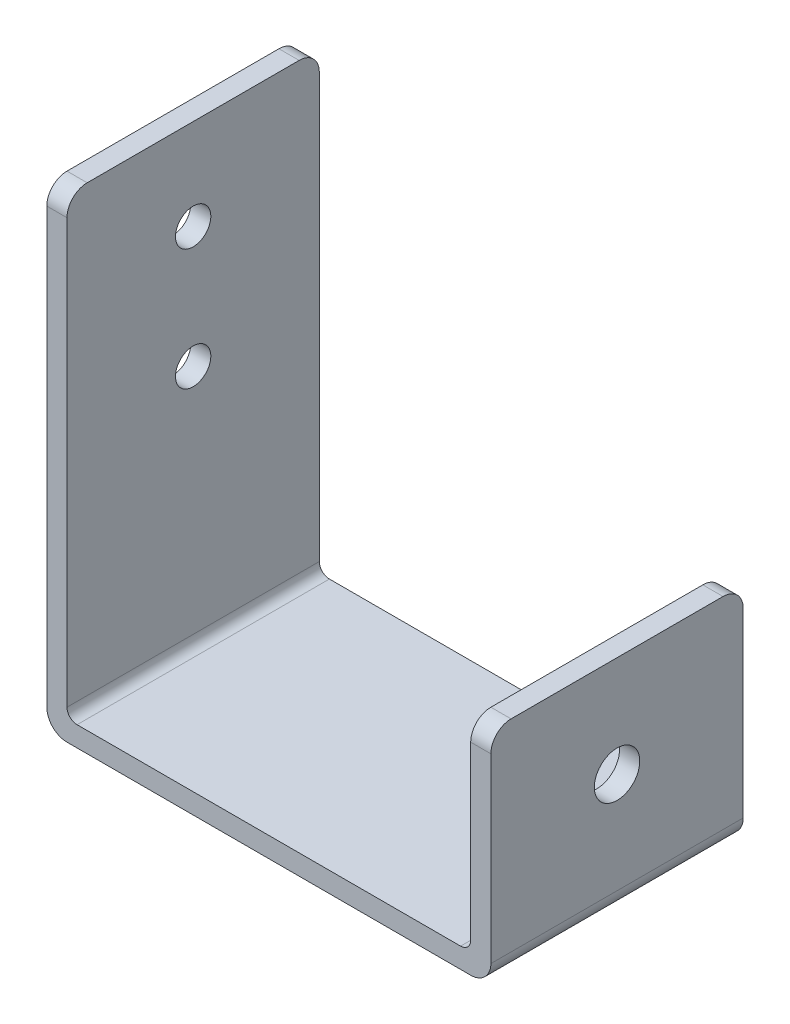
ISO-10303-21;
HEADER;
FILE_DESCRIPTION(('STEP AP214'),'2;1');
FILE_NAME('part.step','',(''),(''),'','','');
FILE_SCHEMA(('AUTOMOTIVE_DESIGN { 1 0 10303 214 1 1 1 1 }'));
ENDSEC;
DATA;
#1=APPLICATION_CONTEXT('core data for automotive mechanical design processes');
#2=APPLICATION_PROTOCOL_DEFINITION('international standard','automotive_design',2000,#1);
#3=PRODUCT_CONTEXT('',#1,'mechanical');
#4=PRODUCT('Part','Part','',(#3));
#5=PRODUCT_RELATED_PRODUCT_CATEGORY('part','',(#4));
#6=PRODUCT_DEFINITION_FORMATION('','',#4);
#7=PRODUCT_DEFINITION_CONTEXT('part definition',#1,'design');
#8=PRODUCT_DEFINITION('design','',#6,#7);
#9=PRODUCT_DEFINITION_SHAPE('','',#8);
#10=(LENGTH_UNIT() NAMED_UNIT(*) SI_UNIT(.MILLI.,.METRE.));
#11=(NAMED_UNIT(*) PLANE_ANGLE_UNIT() SI_UNIT($,.RADIAN.));
#12=(NAMED_UNIT(*) SI_UNIT($,.STERADIAN.) SOLID_ANGLE_UNIT());
#13=UNCERTAINTY_MEASURE_WITH_UNIT(LENGTH_MEASURE(1.E-05),#10,'distance_accuracy_value','');
#14=(GEOMETRIC_REPRESENTATION_CONTEXT(3) GLOBAL_UNCERTAINTY_ASSIGNED_CONTEXT((#13)) GLOBAL_UNIT_ASSIGNED_CONTEXT((#10,
#11,#12)) REPRESENTATION_CONTEXT('',''));
#15=CARTESIAN_POINT('',(0.,0.,0.));
#16=DIRECTION('',(0.,0.,1.));
#17=DIRECTION('',(1.,0.,0.));
#18=AXIS2_PLACEMENT_3D('',#15,#16,#17);
#19=CARTESIAN_POINT('',(42.,0.,25.));
#20=DIRECTION('',(-1.,0.,0.));
#21=DIRECTION('',(0.,0.,1.));
#22=AXIS2_PLACEMENT_3D('',#19,#20,#21);
#23=PLANE('',#22);
#24=CARTESIAN_POINT('',(42.,10.,12.5));
#25=DIRECTION('',(1.,0.,0.));
#26=DIRECTION('',(0.,0.,-1.));
#27=AXIS2_PLACEMENT_3D('',#24,#25,#26);
#28=CIRCLE('',#27,2.25);
#29=CARTESIAN_POINT('',(42.,10.,10.25));
#30=VERTEX_POINT('',#29);
#31=EDGE_CURVE('E291',#30,#30,#28,.T.);
#32=ORIENTED_EDGE('',*,*,#31,.F.);
#33=EDGE_LOOP('',(#32));
#34=FACE_BOUND('',#33,.T.);
#35=DIRECTION('',(0.,0.,-1.));
#36=VECTOR('',#35,1.);
#37=CARTESIAN_POINT('',(42.,20.,25.));
#38=LINE('',#37,#36);
#39=CARTESIAN_POINT('',(42.,20.,23.));
#40=VERTEX_POINT('',#39);
#41=CARTESIAN_POINT('',(42.,20.,2.));
#42=VERTEX_POINT('',#41);
#43=EDGE_CURVE('E172',#40,#42,#38,.T.);
#44=ORIENTED_EDGE('',*,*,#43,.F.);
#45=CARTESIAN_POINT('',(42.,18.,23.));
#46=DIRECTION('',(-1.,0.,0.));
#47=DIRECTION('',(0.,0.,1.));
#48=AXIS2_PLACEMENT_3D('',#45,#46,#47);
#49=CIRCLE('',#48,2.);
#50=CARTESIAN_POINT('',(42.,18.,25.));
#51=VERTEX_POINT('',#50);
#52=EDGE_CURVE('E225',#40,#51,#49,.F.);
#53=ORIENTED_EDGE('',*,*,#52,.T.);
#54=DIRECTION('',(0.,1.,0.));
#55=VECTOR('',#54,1.);
#56=CARTESIAN_POINT('',(42.,0.,25.));
#57=LINE('',#56,#55);
#58=CARTESIAN_POINT('',(42.,0.,25.));
#59=VERTEX_POINT('',#58);
#60=EDGE_CURVE('E257',#59,#51,#57,.T.);
#61=ORIENTED_EDGE('',*,*,#60,.F.);
#62=DIRECTION('',(0.,0.,-1.));
#63=VECTOR('',#62,1.);
#64=CARTESIAN_POINT('',(42.,0.,25.));
#65=LINE('',#64,#63);
#66=CARTESIAN_POINT('',(42.,0.,0.));
#67=VERTEX_POINT('',#66);
#68=EDGE_CURVE('E189',#59,#67,#65,.T.);
#69=ORIENTED_EDGE('',*,*,#68,.T.);
#70=DIRECTION('',(0.,1.,0.));
#71=VECTOR('',#70,1.);
#72=CARTESIAN_POINT('',(42.,0.,0.));
#73=LINE('',#72,#71);
#74=CARTESIAN_POINT('',(42.,18.,0.));
#75=VERTEX_POINT('',#74);
#76=EDGE_CURVE('E263',#67,#75,#73,.T.);
#77=ORIENTED_EDGE('',*,*,#76,.T.);
#78=CARTESIAN_POINT('',(42.,18.,2.));
#79=DIRECTION('',(-1.,0.,0.));
#80=DIRECTION('',(0.,0.,1.));
#81=AXIS2_PLACEMENT_3D('',#78,#79,#80);
#82=CIRCLE('',#81,2.);
#83=EDGE_CURVE('E214',#75,#42,#82,.F.);
#84=ORIENTED_EDGE('',*,*,#83,.T.);
#85=EDGE_LOOP('',(#44,#53,#61,#69,#77,#84));
#86=FACE_BOUND('',#85,.T.);
#87=ADVANCED_FACE('F35',(#34,#86),#23,.F.);
#88=CARTESIAN_POINT('',(40.,20.,25.));
#89=DIRECTION('',(0.,1.,0.));
#90=DIRECTION('',(0.,0.,1.));
#91=AXIS2_PLACEMENT_3D('',#88,#89,#90);
#92=PLANE('',#91);
#93=DIRECTION('',(0.,0.,-1.));
#94=VECTOR('',#93,1.);
#95=CARTESIAN_POINT('',(40.,20.,25.));
#96=LINE('',#95,#94);
#97=CARTESIAN_POINT('',(40.,20.,23.));
#98=VERTEX_POINT('',#97);
#99=CARTESIAN_POINT('',(40.,20.,2.));
#100=VERTEX_POINT('',#99);
#101=EDGE_CURVE('E175',#98,#100,#96,.T.);
#102=ORIENTED_EDGE('',*,*,#101,.F.);
#103=DIRECTION('',(1.,0.,0.));
#104=VECTOR('',#103,1.);
#105=CARTESIAN_POINT('',(42.,20.,23.));
#106=LINE('',#105,#104);
#107=EDGE_CURVE('E222',#98,#40,#106,.T.);
#108=ORIENTED_EDGE('',*,*,#107,.T.);
#109=ORIENTED_EDGE('',*,*,#43,.T.);
#110=DIRECTION('',(1.,0.,0.));
#111=VECTOR('',#110,1.);
#112=CARTESIAN_POINT('',(40.,20.,2.));
#113=LINE('',#112,#111);
#114=EDGE_CURVE('E217',#42,#100,#113,.F.);
#115=ORIENTED_EDGE('',*,*,#114,.T.);
#116=EDGE_LOOP('',(#102,#108,#109,#115));
#117=FACE_BOUND('',#116,.T.);
#118=ADVANCED_FACE('F310',(#117),#92,.T.);
#119=CARTESIAN_POINT('',(40.,0.,25.));
#120=DIRECTION('',(-1.,0.,0.));
#121=DIRECTION('',(0.,0.,1.));
#122=AXIS2_PLACEMENT_3D('',#119,#120,#121);
#123=PLANE('',#122);
#124=CARTESIAN_POINT('',(40.,10.,12.5));
#125=DIRECTION('',(1.,0.,0.));
#126=DIRECTION('',(0.,0.,-1.));
#127=AXIS2_PLACEMENT_3D('',#124,#125,#126);
#128=CIRCLE('',#127,2.25);
#129=CARTESIAN_POINT('',(40.,10.,10.25));
#130=VERTEX_POINT('',#129);
#131=EDGE_CURVE('E288',#130,#130,#128,.T.);
#132=ORIENTED_EDGE('',*,*,#131,.T.);
#133=EDGE_LOOP('',(#132));
#134=FACE_BOUND('',#133,.T.);
#135=DIRECTION('',(0.,1.,0.));
#136=VECTOR('',#135,1.);
#137=CARTESIAN_POINT('',(40.,0.,25.));
#138=LINE('',#137,#136);
#139=CARTESIAN_POINT('',(40.,1.,25.));
#140=VERTEX_POINT('',#139);
#141=CARTESIAN_POINT('',(40.,18.,25.));
#142=VERTEX_POINT('',#141);
#143=EDGE_CURVE('E274',#140,#142,#138,.T.);
#144=ORIENTED_EDGE('',*,*,#143,.T.);
#145=CARTESIAN_POINT('',(40.,18.,23.));
#146=DIRECTION('',(-1.,0.,0.));
#147=DIRECTION('',(0.,0.,1.));
#148=AXIS2_PLACEMENT_3D('',#145,#146,#147);
#149=CIRCLE('',#148,2.);
#150=EDGE_CURVE('E229',#142,#98,#149,.T.);
#151=ORIENTED_EDGE('',*,*,#150,.T.);
#152=ORIENTED_EDGE('',*,*,#101,.T.);
#153=CARTESIAN_POINT('',(40.,18.,2.));
#154=DIRECTION('',(-1.,0.,0.));
#155=DIRECTION('',(0.,0.,1.));
#156=AXIS2_PLACEMENT_3D('',#153,#154,#155);
#157=CIRCLE('',#156,2.);
#158=CARTESIAN_POINT('',(40.,18.,0.));
#159=VERTEX_POINT('',#158);
#160=EDGE_CURVE('E220',#100,#159,#157,.T.);
#161=ORIENTED_EDGE('',*,*,#160,.T.);
#162=DIRECTION('',(0.,1.,0.));
#163=VECTOR('',#162,1.);
#164=CARTESIAN_POINT('',(40.,0.,0.));
#165=LINE('',#164,#163);
#166=CARTESIAN_POINT('',(40.,1.,0.));
#167=VERTEX_POINT('',#166);
#168=EDGE_CURVE('E260',#167,#159,#165,.T.);
#169=ORIENTED_EDGE('',*,*,#168,.F.);
#170=DIRECTION('',(0.,0.,-1.));
#171=VECTOR('',#170,1.);
#172=CARTESIAN_POINT('',(40.,1.,25.));
#173=LINE('',#172,#171);
#174=EDGE_CURVE('E183',#167,#140,#173,.F.);
#175=ORIENTED_EDGE('',*,*,#174,.T.);
#176=EDGE_LOOP('',(#144,#151,#152,#161,#169,#175));
#177=FACE_BOUND('',#176,.T.);
#178=ADVANCED_FACE('F297',(#134,#177),#123,.T.);
#179=CARTESIAN_POINT('',(0.,0.,25.));
#180=DIRECTION('',(0.,1.,0.));
#181=DIRECTION('',(0.,0.,1.));
#182=AXIS2_PLACEMENT_3D('',#179,#180,#181);
#183=PLANE('',#182);
#184=DIRECTION('',(1.,0.,0.));
#185=VECTOR('',#184,1.);
#186=CARTESIAN_POINT('',(0.,0.,25.));
#187=LINE('',#186,#185);
#188=CARTESIAN_POINT('',(1.,0.,25.));
#189=VERTEX_POINT('',#188);
#190=CARTESIAN_POINT('',(39.,0.,25.));
#191=VERTEX_POINT('',#190);
#192=EDGE_CURVE('E271',#189,#191,#187,.T.);
#193=ORIENTED_EDGE('',*,*,#192,.T.);
#194=DIRECTION('',(0.,0.,-1.));
#195=VECTOR('',#194,1.);
#196=CARTESIAN_POINT('',(39.,0.,0.));
#197=LINE('',#196,#195);
#198=CARTESIAN_POINT('',(39.,0.,0.));
#199=VERTEX_POINT('',#198);
#200=EDGE_CURVE('E180',#191,#199,#197,.T.);
#201=ORIENTED_EDGE('',*,*,#200,.T.);
#202=DIRECTION('',(1.,0.,0.));
#203=VECTOR('',#202,1.);
#204=CARTESIAN_POINT('',(0.,0.,0.));
#205=LINE('',#204,#203);
#206=CARTESIAN_POINT('',(1.,0.,0.));
#207=VERTEX_POINT('',#206);
#208=EDGE_CURVE('E158',#207,#199,#205,.T.);
#209=ORIENTED_EDGE('',*,*,#208,.F.);
#210=DIRECTION('',(0.,0.,-1.));
#211=VECTOR('',#210,1.);
#212=CARTESIAN_POINT('',(1.,0.,25.));
#213=LINE('',#212,#211);
#214=EDGE_CURVE('E166',#207,#189,#213,.F.);
#215=ORIENTED_EDGE('',*,*,#214,.T.);
#216=EDGE_LOOP('',(#193,#201,#209,#215));
#217=FACE_BOUND('',#216,.T.);
#218=ADVANCED_FACE('F333',(#217),#183,.T.);
#219=CARTESIAN_POINT('',(0.,0.,25.));
#220=DIRECTION('',(1.,0.,0.));
#221=DIRECTION('',(0.,0.,-1.));
#222=AXIS2_PLACEMENT_3D('',#219,#220,#221);
#223=PLANE('',#222);
#224=CARTESIAN_POINT('',(0.,24.,12.5));
#225=DIRECTION('',(-1.,0.,0.));
#226=DIRECTION('',(0.,0.,1.));
#227=AXIS2_PLACEMENT_3D('',#224,#225,#226);
#228=CIRCLE('',#227,1.75);
#229=CARTESIAN_POINT('',(0.,24.,14.25));
#230=VERTEX_POINT('',#229);
#231=EDGE_CURVE('E282',#230,#230,#228,.T.);
#232=ORIENTED_EDGE('',*,*,#231,.T.);
#233=EDGE_LOOP('',(#232));
#234=FACE_BOUND('',#233,.T.);
#235=CARTESIAN_POINT('',(0.,36.,12.5));
#236=DIRECTION('',(-1.,0.,0.));
#237=DIRECTION('',(0.,0.,1.));
#238=AXIS2_PLACEMENT_3D('',#235,#236,#237);
#239=CIRCLE('',#238,1.75);
#240=CARTESIAN_POINT('',(0.,36.,14.25));
#241=VERTEX_POINT('',#240);
#242=EDGE_CURVE('E266',#241,#241,#239,.T.);
#243=ORIENTED_EDGE('',*,*,#242,.T.);
#244=EDGE_LOOP('',(#243));
#245=FACE_BOUND('',#244,.T.);
#246=DIRECTION('',(0.,0.,-1.));
#247=VECTOR('',#246,1.);
#248=CARTESIAN_POINT('',(0.,45.,25.));
#249=LINE('',#248,#247);
#250=CARTESIAN_POINT('',(0.,45.,23.));
#251=VERTEX_POINT('',#250);
#252=CARTESIAN_POINT('',(0.,45.,2.));
#253=VERTEX_POINT('',#252);
#254=EDGE_CURVE('E246',#251,#253,#249,.T.);
#255=ORIENTED_EDGE('',*,*,#254,.F.);
#256=CARTESIAN_POINT('',(0.,43.,23.));
#257=DIRECTION('',(1.,0.,0.));
#258=DIRECTION('',(0.,0.,-1.));
#259=AXIS2_PLACEMENT_3D('',#256,#257,#258);
#260=CIRCLE('',#259,2.);
#261=CARTESIAN_POINT('',(0.,43.,25.));
#262=VERTEX_POINT('',#261);
#263=EDGE_CURVE('E57',#251,#262,#260,.T.);
#264=ORIENTED_EDGE('',*,*,#263,.T.);
#265=DIRECTION('',(0.,-1.,0.));
#266=VECTOR('',#265,1.);
#267=CARTESIAN_POINT('',(0.,0.,25.));
#268=LINE('',#267,#266);
#269=CARTESIAN_POINT('',(0.,1.,25.));
#270=VERTEX_POINT('',#269);
#271=EDGE_CURVE('E170',#262,#270,#268,.T.);
#272=ORIENTED_EDGE('',*,*,#271,.T.);
#273=DIRECTION('',(0.,0.,-1.));
#274=VECTOR('',#273,1.);
#275=CARTESIAN_POINT('',(0.,1.,0.));
#276=LINE('',#275,#274);
#277=CARTESIAN_POINT('',(0.,1.,0.));
#278=VERTEX_POINT('',#277);
#279=EDGE_CURVE('E165',#270,#278,#276,.T.);
#280=ORIENTED_EDGE('',*,*,#279,.T.);
#281=DIRECTION('',(0.,-1.,0.));
#282=VECTOR('',#281,1.);
#283=CARTESIAN_POINT('',(0.,0.,0.));
#284=LINE('',#283,#282);
#285=CARTESIAN_POINT('',(0.,43.,0.));
#286=VERTEX_POINT('',#285);
#287=EDGE_CURVE('E146',#286,#278,#284,.T.);
#288=ORIENTED_EDGE('',*,*,#287,.F.);
#289=CARTESIAN_POINT('',(0.,43.,2.));
#290=DIRECTION('',(1.,0.,0.));
#291=DIRECTION('',(0.,0.,-1.));
#292=AXIS2_PLACEMENT_3D('',#289,#290,#291);
#293=CIRCLE('',#292,2.);
#294=EDGE_CURVE('E232',#286,#253,#293,.T.);
#295=ORIENTED_EDGE('',*,*,#294,.T.);
#296=EDGE_LOOP('',(#255,#264,#272,#280,#288,#295));
#297=FACE_BOUND('',#296,.T.);
#298=ADVANCED_FACE('F169',(#234,#245,#297),#223,.T.);
#299=CARTESIAN_POINT('',(-2.,45.,25.));
#300=DIRECTION('',(0.,1.,0.));
#301=DIRECTION('',(0.,0.,1.));
#302=AXIS2_PLACEMENT_3D('',#299,#300,#301);
#303=PLANE('',#302);
#304=DIRECTION('',(0.,0.,-1.));
#305=VECTOR('',#304,1.);
#306=CARTESIAN_POINT('',(-2.,45.,25.));
#307=LINE('',#306,#305);
#308=CARTESIAN_POINT('',(-2.,45.,23.));
#309=VERTEX_POINT('',#308);
#310=CARTESIAN_POINT('',(-2.,45.,2.));
#311=VERTEX_POINT('',#310);
#312=EDGE_CURVE('E247',#309,#311,#307,.T.);
#313=ORIENTED_EDGE('',*,*,#312,.F.);
#314=DIRECTION('',(1.,0.,0.));
#315=VECTOR('',#314,1.);
#316=CARTESIAN_POINT('',(0.,45.,23.));
#317=LINE('',#316,#315);
#318=EDGE_CURVE('E239',#309,#251,#317,.T.);
#319=ORIENTED_EDGE('',*,*,#318,.T.);
#320=ORIENTED_EDGE('',*,*,#254,.T.);
#321=DIRECTION('',(1.,0.,0.));
#322=VECTOR('',#321,1.);
#323=CARTESIAN_POINT('',(-2.,45.,2.));
#324=LINE('',#323,#322);
#325=EDGE_CURVE('E234',#253,#311,#324,.F.);
#326=ORIENTED_EDGE('',*,*,#325,.T.);
#327=EDGE_LOOP('',(#313,#319,#320,#326));
#328=FACE_BOUND('',#327,.T.);
#329=ADVANCED_FACE('F245',(#328),#303,.T.);
#330=CARTESIAN_POINT('',(-2.,0.,25.));
#331=DIRECTION('',(1.,0.,0.));
#332=DIRECTION('',(0.,0.,-1.));
#333=AXIS2_PLACEMENT_3D('',#330,#331,#332);
#334=PLANE('',#333);
#335=CARTESIAN_POINT('',(-2.,24.,12.5));
#336=DIRECTION('',(-1.,0.,0.));
#337=DIRECTION('',(0.,0.,1.));
#338=AXIS2_PLACEMENT_3D('',#335,#336,#337);
#339=CIRCLE('',#338,1.75);
#340=CARTESIAN_POINT('',(-2.,24.,14.25));
#341=VERTEX_POINT('',#340);
#342=EDGE_CURVE('E285',#341,#341,#339,.T.);
#343=ORIENTED_EDGE('',*,*,#342,.F.);
#344=EDGE_LOOP('',(#343));
#345=FACE_BOUND('',#344,.T.);
#346=CARTESIAN_POINT('',(-2.,36.,12.5));
#347=DIRECTION('',(-1.,0.,0.));
#348=DIRECTION('',(0.,0.,1.));
#349=AXIS2_PLACEMENT_3D('',#346,#347,#348);
#350=CIRCLE('',#349,1.75);
#351=CARTESIAN_POINT('',(-2.,36.,14.25));
#352=VERTEX_POINT('',#351);
#353=EDGE_CURVE('E279',#352,#352,#350,.T.);
#354=ORIENTED_EDGE('',*,*,#353,.F.);
#355=EDGE_LOOP('',(#354));
#356=FACE_BOUND('',#355,.T.);
#357=DIRECTION('',(0.,1.,0.));
#358=VECTOR('',#357,1.);
#359=CARTESIAN_POINT('',(-2.,0.,25.));
#360=LINE('',#359,#358);
#361=CARTESIAN_POINT('',(-2.,43.,25.));
#362=VERTEX_POINT('',#361);
#363=CARTESIAN_POINT('',(-2.,0.,25.));
#364=VERTEX_POINT('',#363);
#365=EDGE_CURVE('E268',#362,#364,#360,.F.);
#366=ORIENTED_EDGE('',*,*,#365,.F.);
#367=CARTESIAN_POINT('',(-2.,43.,23.));
#368=DIRECTION('',(1.,0.,0.));
#369=DIRECTION('',(0.,0.,-1.));
#370=AXIS2_PLACEMENT_3D('',#367,#368,#369);
#371=CIRCLE('',#370,2.);
#372=EDGE_CURVE('E11',#362,#309,#371,.F.);
#373=ORIENTED_EDGE('',*,*,#372,.T.);
#374=ORIENTED_EDGE('',*,*,#312,.T.);
#375=CARTESIAN_POINT('',(-2.,43.,2.));
#376=DIRECTION('',(1.,0.,0.));
#377=DIRECTION('',(0.,0.,-1.));
#378=AXIS2_PLACEMENT_3D('',#375,#376,#377);
#379=CIRCLE('',#378,2.);
#380=CARTESIAN_POINT('',(-2.,43.,0.));
#381=VERTEX_POINT('',#380);
#382=EDGE_CURVE('E237',#311,#381,#379,.F.);
#383=ORIENTED_EDGE('',*,*,#382,.T.);
#384=DIRECTION('',(0.,1.,0.));
#385=VECTOR('',#384,1.);
#386=CARTESIAN_POINT('',(-2.,0.,0.));
#387=LINE('',#386,#385);
#388=CARTESIAN_POINT('',(-2.,0.,0.));
#389=VERTEX_POINT('',#388);
#390=EDGE_CURVE('E157',#381,#389,#387,.F.);
#391=ORIENTED_EDGE('',*,*,#390,.T.);
#392=DIRECTION('',(0.,0.,-1.));
#393=VECTOR('',#392,1.);
#394=CARTESIAN_POINT('',(-2.,0.,25.));
#395=LINE('',#394,#393);
#396=EDGE_CURVE('E206',#389,#364,#395,.F.);
#397=ORIENTED_EDGE('',*,*,#396,.T.);
#398=EDGE_LOOP('',(#366,#373,#374,#383,#391,#397));
#399=FACE_BOUND('',#398,.T.);
#400=ADVANCED_FACE('F354',(#345,#356,#399),#334,.F.);
#401=CARTESIAN_POINT('',(0.,-2.,25.));
#402=DIRECTION('',(0.,1.,0.));
#403=DIRECTION('',(0.,0.,1.));
#404=AXIS2_PLACEMENT_3D('',#401,#402,#403);
#405=PLANE('',#404);
#406=DIRECTION('',(1.,0.,0.));
#407=VECTOR('',#406,1.);
#408=CARTESIAN_POINT('',(0.,-2.,25.));
#409=LINE('',#408,#407);
#410=CARTESIAN_POINT('',(0.,-2.,25.));
#411=VERTEX_POINT('',#410);
#412=CARTESIAN_POINT('',(40.,-2.,25.));
#413=VERTEX_POINT('',#412);
#414=EDGE_CURVE('E252',#411,#413,#409,.T.);
#415=ORIENTED_EDGE('',*,*,#414,.F.);
#416=DIRECTION('',(0.,0.,-1.));
#417=VECTOR('',#416,1.);
#418=CARTESIAN_POINT('',(0.,-2.,25.));
#419=LINE('',#418,#417);
#420=CARTESIAN_POINT('',(0.,-2.,0.));
#421=VERTEX_POINT('',#420);
#422=EDGE_CURVE('E200',#411,#421,#419,.T.);
#423=ORIENTED_EDGE('',*,*,#422,.T.);
#424=DIRECTION('',(1.,0.,0.));
#425=VECTOR('',#424,1.);
#426=CARTESIAN_POINT('',(0.,-2.,0.));
#427=LINE('',#426,#425);
#428=CARTESIAN_POINT('',(40.,-2.,0.));
#429=VERTEX_POINT('',#428);
#430=EDGE_CURVE('E255',#421,#429,#427,.T.);
#431=ORIENTED_EDGE('',*,*,#430,.T.);
#432=DIRECTION('',(0.,0.,-1.));
#433=VECTOR('',#432,1.);
#434=CARTESIAN_POINT('',(40.,-2.,25.));
#435=LINE('',#434,#433);
#436=EDGE_CURVE('E195',#429,#413,#435,.F.);
#437=ORIENTED_EDGE('',*,*,#436,.T.);
#438=EDGE_LOOP('',(#415,#423,#431,#437));
#439=FACE_BOUND('',#438,.T.);
#440=ADVANCED_FACE('F362',(#439),#405,.F.);
#441=CARTESIAN_POINT('',(0.,0.,25.));
#442=DIRECTION('',(0.,0.,-1.));
#443=DIRECTION('',(-1.,0.,0.));
#444=AXIS2_PLACEMENT_3D('',#441,#442,#443);
#445=PLANE('',#444);
#446=ORIENTED_EDGE('',*,*,#271,.F.);
#447=DIRECTION('',(1.,0.,0.));
#448=VECTOR('',#447,1.);
#449=CARTESIAN_POINT('',(-2.,43.,25.));
#450=LINE('',#449,#448);
#451=EDGE_CURVE('E43',#262,#362,#450,.F.);
#452=ORIENTED_EDGE('',*,*,#451,.T.);
#453=ORIENTED_EDGE('',*,*,#365,.T.);
#454=CARTESIAN_POINT('',(0.,0.,25.));
#455=DIRECTION('',(0.,0.,-1.));
#456=DIRECTION('',(-1.,0.,0.));
#457=AXIS2_PLACEMENT_3D('',#454,#455,#456);
#458=CIRCLE('',#457,2.);
#459=EDGE_CURVE('E209',#364,#411,#458,.F.);
#460=ORIENTED_EDGE('',*,*,#459,.T.);
#461=ORIENTED_EDGE('',*,*,#414,.T.);
#462=CARTESIAN_POINT('',(40.,0.,25.));
#463=DIRECTION('',(0.,0.,-1.));
#464=DIRECTION('',(-1.,0.,0.));
#465=AXIS2_PLACEMENT_3D('',#462,#463,#464);
#466=CIRCLE('',#465,2.);
#467=EDGE_CURVE('E198',#413,#59,#466,.F.);
#468=ORIENTED_EDGE('',*,*,#467,.T.);
#469=ORIENTED_EDGE('',*,*,#60,.T.);
#470=DIRECTION('',(1.,0.,0.));
#471=VECTOR('',#470,1.);
#472=CARTESIAN_POINT('',(40.,18.,25.));
#473=LINE('',#472,#471);
#474=EDGE_CURVE('E227',#51,#142,#473,.F.);
#475=ORIENTED_EDGE('',*,*,#474,.T.);
#476=ORIENTED_EDGE('',*,*,#143,.F.);
#477=CARTESIAN_POINT('',(39.,1.,25.));
#478=DIRECTION('',(0.,0.,-1.));
#479=DIRECTION('',(-1.,0.,0.));
#480=AXIS2_PLACEMENT_3D('',#477,#478,#479);
#481=CIRCLE('',#480,1.);
#482=EDGE_CURVE('E187',#140,#191,#481,.T.);
#483=ORIENTED_EDGE('',*,*,#482,.T.);
#484=ORIENTED_EDGE('',*,*,#192,.F.);
#485=CARTESIAN_POINT('',(1.,1.,25.));
#486=DIRECTION('',(0.,0.,-1.));
#487=DIRECTION('',(-1.,0.,0.));
#488=AXIS2_PLACEMENT_3D('',#485,#486,#487);
#489=CIRCLE('',#488,1.);
#490=EDGE_CURVE('E167',#189,#270,#489,.T.);
#491=ORIENTED_EDGE('',*,*,#490,.T.);
#492=EDGE_LOOP('',(#446,#452,#453,#460,#461,#468,#469,#475,#476,#483,#484,#491));
#493=FACE_BOUND('',#492,.T.);
#494=ADVANCED_FACE('F324',(#493),#445,.F.);
#495=CARTESIAN_POINT('',(0.,0.,0.));
#496=DIRECTION('',(0.,0.,-1.));
#497=DIRECTION('',(-1.,0.,0.));
#498=AXIS2_PLACEMENT_3D('',#495,#496,#497);
#499=PLANE('',#498);
#500=ORIENTED_EDGE('',*,*,#390,.F.);
#501=DIRECTION('',(1.,0.,0.));
#502=VECTOR('',#501,1.);
#503=CARTESIAN_POINT('',(0.,43.,0.));
#504=LINE('',#503,#502);
#505=EDGE_CURVE('E154',#381,#286,#504,.T.);
#506=ORIENTED_EDGE('',*,*,#505,.T.);
#507=ORIENTED_EDGE('',*,*,#287,.T.);
#508=CARTESIAN_POINT('',(1.,1.,0.));
#509=DIRECTION('',(0.,0.,-1.));
#510=DIRECTION('',(-1.,0.,0.));
#511=AXIS2_PLACEMENT_3D('',#508,#509,#510);
#512=CIRCLE('',#511,1.);
#513=EDGE_CURVE('E151',#278,#207,#512,.F.);
#514=ORIENTED_EDGE('',*,*,#513,.T.);
#515=ORIENTED_EDGE('',*,*,#208,.T.);
#516=CARTESIAN_POINT('',(39.,1.,0.));
#517=DIRECTION('',(0.,0.,-1.));
#518=DIRECTION('',(-1.,0.,0.));
#519=AXIS2_PLACEMENT_3D('',#516,#517,#518);
#520=CIRCLE('',#519,1.);
#521=EDGE_CURVE('E185',#199,#167,#520,.F.);
#522=ORIENTED_EDGE('',*,*,#521,.T.);
#523=ORIENTED_EDGE('',*,*,#168,.T.);
#524=DIRECTION('',(1.,0.,0.));
#525=VECTOR('',#524,1.);
#526=CARTESIAN_POINT('',(0.,18.,0.));
#527=LINE('',#526,#525);
#528=EDGE_CURVE('E211',#159,#75,#527,.T.);
#529=ORIENTED_EDGE('',*,*,#528,.T.);
#530=ORIENTED_EDGE('',*,*,#76,.F.);
#531=CARTESIAN_POINT('',(40.,0.,0.));
#532=DIRECTION('',(0.,0.,-1.));
#533=DIRECTION('',(-1.,0.,0.));
#534=AXIS2_PLACEMENT_3D('',#531,#532,#533);
#535=CIRCLE('',#534,2.);
#536=EDGE_CURVE('E192',#67,#429,#535,.T.);
#537=ORIENTED_EDGE('',*,*,#536,.T.);
#538=ORIENTED_EDGE('',*,*,#430,.F.);
#539=CARTESIAN_POINT('',(0.,0.,0.));
#540=DIRECTION('',(0.,0.,-1.));
#541=DIRECTION('',(-1.,0.,0.));
#542=AXIS2_PLACEMENT_3D('',#539,#540,#541);
#543=CIRCLE('',#542,2.);
#544=EDGE_CURVE('E203',#421,#389,#543,.T.);
#545=ORIENTED_EDGE('',*,*,#544,.T.);
#546=EDGE_LOOP('',(#500,#506,#507,#514,#515,#522,#523,#529,#530,#537,#538,#545));
#547=FACE_BOUND('',#546,.T.);
#548=ADVANCED_FACE('F149',(#547),#499,.T.);
#549=CARTESIAN_POINT('',(1.,1.,25.));
#550=DIRECTION('',(0.,0.,1.));
#551=DIRECTION('',(1.,0.,0.));
#552=AXIS2_PLACEMENT_3D('',#549,#550,#551);
#553=CYLINDRICAL_SURFACE('',#552,1.);
#554=ORIENTED_EDGE('',*,*,#490,.F.);
#555=ORIENTED_EDGE('',*,*,#214,.F.);
#556=ORIENTED_EDGE('',*,*,#513,.F.);
#557=ORIENTED_EDGE('',*,*,#279,.F.);
#558=EDGE_LOOP('',(#554,#555,#556,#557));
#559=FACE_BOUND('',#558,.T.);
#560=ADVANCED_FACE('F164',(#559),#553,.F.);
#561=CARTESIAN_POINT('',(39.,1.,25.));
#562=DIRECTION('',(0.,0.,1.));
#563=DIRECTION('',(1.,0.,0.));
#564=AXIS2_PLACEMENT_3D('',#561,#562,#563);
#565=CYLINDRICAL_SURFACE('',#564,1.);
#566=ORIENTED_EDGE('',*,*,#482,.F.);
#567=ORIENTED_EDGE('',*,*,#174,.F.);
#568=ORIENTED_EDGE('',*,*,#521,.F.);
#569=ORIENTED_EDGE('',*,*,#200,.F.);
#570=EDGE_LOOP('',(#566,#567,#568,#569));
#571=FACE_BOUND('',#570,.T.);
#572=ADVANCED_FACE('F329',(#571),#565,.F.);
#573=CARTESIAN_POINT('',(40.,0.,25.));
#574=DIRECTION('',(0.,0.,-1.));
#575=DIRECTION('',(-1.,0.,0.));
#576=AXIS2_PLACEMENT_3D('',#573,#574,#575);
#577=CYLINDRICAL_SURFACE('',#576,2.);
#578=ORIENTED_EDGE('',*,*,#467,.F.);
#579=ORIENTED_EDGE('',*,*,#436,.F.);
#580=ORIENTED_EDGE('',*,*,#536,.F.);
#581=ORIENTED_EDGE('',*,*,#68,.F.);
#582=EDGE_LOOP('',(#578,#579,#580,#581));
#583=FACE_BOUND('',#582,.T.);
#584=ADVANCED_FACE('F367',(#583),#577,.T.);
#585=CARTESIAN_POINT('',(0.,0.,25.));
#586=DIRECTION('',(0.,0.,-1.));
#587=DIRECTION('',(-1.,0.,0.));
#588=AXIS2_PLACEMENT_3D('',#585,#586,#587);
#589=CYLINDRICAL_SURFACE('',#588,2.);
#590=ORIENTED_EDGE('',*,*,#459,.F.);
#591=ORIENTED_EDGE('',*,*,#396,.F.);
#592=ORIENTED_EDGE('',*,*,#544,.F.);
#593=ORIENTED_EDGE('',*,*,#422,.F.);
#594=EDGE_LOOP('',(#590,#591,#592,#593));
#595=FACE_BOUND('',#594,.T.);
#596=ADVANCED_FACE('F345',(#595),#589,.T.);
#597=CARTESIAN_POINT('',(0.,36.,12.5));
#598=DIRECTION('',(-1.,0.,0.));
#599=DIRECTION('',(0.,0.,1.));
#600=AXIS2_PLACEMENT_3D('',#597,#598,#599);
#601=CYLINDRICAL_SURFACE('',#600,1.75);
#602=ORIENTED_EDGE('',*,*,#242,.F.);
#603=EDGE_LOOP('',(#602));
#604=FACE_BOUND('',#603,.T.);
#605=ORIENTED_EDGE('',*,*,#353,.T.);
#606=EDGE_LOOP('',(#605));
#607=FACE_BOUND('',#606,.T.);
#608=ADVANCED_FACE('F373',(#604,#607),#601,.F.);
#609=CARTESIAN_POINT('',(0.,24.,12.5));
#610=DIRECTION('',(-1.,0.,0.));
#611=DIRECTION('',(0.,0.,1.));
#612=AXIS2_PLACEMENT_3D('',#609,#610,#611);
#613=CYLINDRICAL_SURFACE('',#612,1.75);
#614=ORIENTED_EDGE('',*,*,#231,.F.);
#615=EDGE_LOOP('',(#614));
#616=FACE_BOUND('',#615,.T.);
#617=ORIENTED_EDGE('',*,*,#342,.T.);
#618=EDGE_LOOP('',(#617));
#619=FACE_BOUND('',#618,.T.);
#620=ADVANCED_FACE('F304',(#616,#619),#613,.F.);
#621=CARTESIAN_POINT('',(40.,10.,12.5));
#622=DIRECTION('',(1.,0.,0.));
#623=DIRECTION('',(0.,0.,-1.));
#624=AXIS2_PLACEMENT_3D('',#621,#622,#623);
#625=CYLINDRICAL_SURFACE('',#624,2.25);
#626=ORIENTED_EDGE('',*,*,#131,.F.);
#627=EDGE_LOOP('',(#626));
#628=FACE_BOUND('',#627,.T.);
#629=ORIENTED_EDGE('',*,*,#31,.T.);
#630=EDGE_LOOP('',(#629));
#631=FACE_BOUND('',#630,.T.);
#632=ADVANCED_FACE('F300',(#628,#631),#625,.F.);
#633=CARTESIAN_POINT('',(0.,18.,2.));
#634=DIRECTION('',(1.,0.,0.));
#635=DIRECTION('',(0.,0.,-1.));
#636=AXIS2_PLACEMENT_3D('',#633,#634,#635);
#637=CYLINDRICAL_SURFACE('',#636,2.);
#638=ORIENTED_EDGE('',*,*,#160,.F.);
#639=ORIENTED_EDGE('',*,*,#114,.F.);
#640=ORIENTED_EDGE('',*,*,#83,.F.);
#641=ORIENTED_EDGE('',*,*,#528,.F.);
#642=EDGE_LOOP('',(#638,#639,#640,#641));
#643=FACE_BOUND('',#642,.T.);
#644=ADVANCED_FACE('F303',(#643),#637,.T.);
#645=CARTESIAN_POINT('',(40.,18.,23.));
#646=DIRECTION('',(-1.,0.,0.));
#647=DIRECTION('',(0.,0.,1.));
#648=AXIS2_PLACEMENT_3D('',#645,#646,#647);
#649=CYLINDRICAL_SURFACE('',#648,2.);
#650=ORIENTED_EDGE('',*,*,#150,.F.);
#651=ORIENTED_EDGE('',*,*,#474,.F.);
#652=ORIENTED_EDGE('',*,*,#52,.F.);
#653=ORIENTED_EDGE('',*,*,#107,.F.);
#654=EDGE_LOOP('',(#650,#651,#652,#653));
#655=FACE_BOUND('',#654,.T.);
#656=ADVANCED_FACE('F321',(#655),#649,.T.);
#657=CARTESIAN_POINT('',(0.,43.,2.));
#658=DIRECTION('',(1.,0.,0.));
#659=DIRECTION('',(0.,0.,-1.));
#660=AXIS2_PLACEMENT_3D('',#657,#658,#659);
#661=CYLINDRICAL_SURFACE('',#660,2.);
#662=ORIENTED_EDGE('',*,*,#382,.F.);
#663=ORIENTED_EDGE('',*,*,#325,.F.);
#664=ORIENTED_EDGE('',*,*,#294,.F.);
#665=ORIENTED_EDGE('',*,*,#505,.F.);
#666=EDGE_LOOP('',(#662,#663,#664,#665));
#667=FACE_BOUND('',#666,.T.);
#668=ADVANCED_FACE('F342',(#667),#661,.T.);
#669=CARTESIAN_POINT('',(-2.,43.,23.));
#670=DIRECTION('',(-1.,0.,0.));
#671=DIRECTION('',(0.,0.,1.));
#672=AXIS2_PLACEMENT_3D('',#669,#670,#671);
#673=CYLINDRICAL_SURFACE('',#672,2.);
#674=ORIENTED_EDGE('',*,*,#372,.F.);
#675=ORIENTED_EDGE('',*,*,#451,.F.);
#676=ORIENTED_EDGE('',*,*,#263,.F.);
#677=ORIENTED_EDGE('',*,*,#318,.F.);
#678=EDGE_LOOP('',(#674,#675,#676,#677));
#679=FACE_BOUND('',#678,.T.);
#680=ADVANCED_FACE('F37',(#679),#673,.T.);
#681=CLOSED_SHELL('',(#87,#118,#178,#218,#298,#329,#400,#440,#494,#548,#560,#572,#584,#596,#608,
#620,#632,#644,#656,#668,#680));
#682=MANIFOLD_SOLID_BREP('B2',#681);
#683=ADVANCED_BREP_SHAPE_REPRESENTATION('',(#18,#682),#14);
#684=SHAPE_DEFINITION_REPRESENTATION(#9,#683);
ENDSEC;
END-ISO-10303-21;
